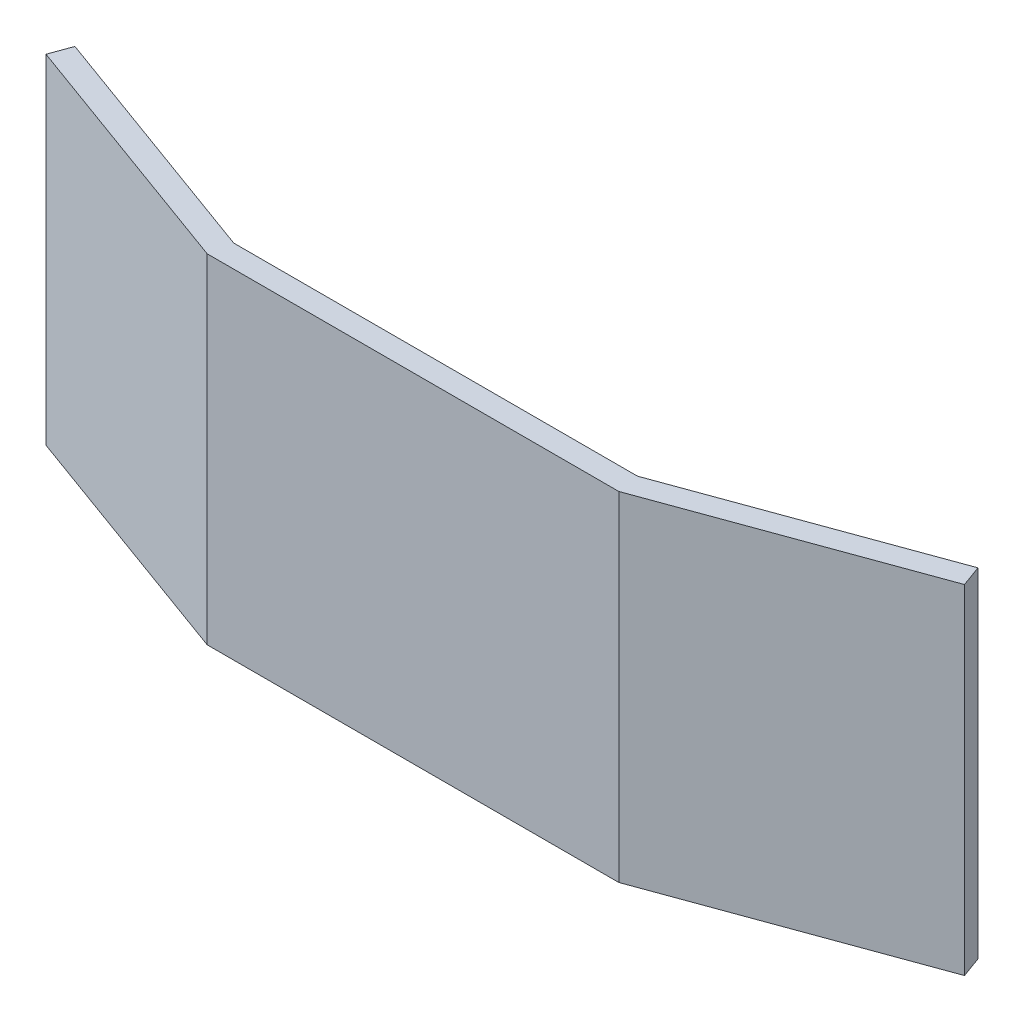
ISO-10303-21;
HEADER;
FILE_DESCRIPTION(('STEP AP214'),'2;1');
FILE_NAME('part.step','',(''),(''),'','','');
FILE_SCHEMA(('AUTOMOTIVE_DESIGN { 1 0 10303 214 1 1 1 1 }'));
ENDSEC;
DATA;
#1=APPLICATION_CONTEXT('core data for automotive mechanical design processes');
#2=APPLICATION_PROTOCOL_DEFINITION('international standard','automotive_design',2000,#1);
#3=PRODUCT_CONTEXT('',#1,'mechanical');
#4=PRODUCT('Part','Part','',(#3));
#5=PRODUCT_RELATED_PRODUCT_CATEGORY('part','',(#4));
#6=PRODUCT_DEFINITION_FORMATION('','',#4);
#7=PRODUCT_DEFINITION_CONTEXT('part definition',#1,'design');
#8=PRODUCT_DEFINITION('design','',#6,#7);
#9=PRODUCT_DEFINITION_SHAPE('','',#8);
#10=(LENGTH_UNIT() NAMED_UNIT(*) SI_UNIT(.MILLI.,.METRE.));
#11=(NAMED_UNIT(*) PLANE_ANGLE_UNIT() SI_UNIT($,.RADIAN.));
#12=(NAMED_UNIT(*) SI_UNIT($,.STERADIAN.) SOLID_ANGLE_UNIT());
#13=UNCERTAINTY_MEASURE_WITH_UNIT(LENGTH_MEASURE(1.E-05),#10,'distance_accuracy_value','');
#14=(GEOMETRIC_REPRESENTATION_CONTEXT(3) GLOBAL_UNCERTAINTY_ASSIGNED_CONTEXT((#13)) GLOBAL_UNIT_ASSIGNED_CONTEXT((#10,
#11,#12)) REPRESENTATION_CONTEXT('',''));
#15=CARTESIAN_POINT('',(0.,0.,0.));
#16=DIRECTION('',(0.,0.,1.));
#17=DIRECTION('',(1.,0.,0.));
#18=AXIS2_PLACEMENT_3D('',#15,#16,#17);
#19=CARTESIAN_POINT('',(-39.9999999999988,30.,-10.0508742855402));
#20=DIRECTION('',(-0.342020143325662,0.,0.939692620785911));
#21=DIRECTION('',(0.939692620785911,0.,0.342020143325662));
#22=AXIS2_PLACEMENT_3D('',#19,#20,#21);
#23=PLANE('',#22);
#24=DIRECTION('',(-0.939692620785911,0.,-0.342020143325662));
#25=VECTOR('',#24,1.);
#26=CARTESIAN_POINT('',(-39.9999999999988,0.,-10.0508742855402));
#27=LINE('',#26,#25);
#28=CARTESIAN_POINT('',(-17.8804046936088,0.,-2.));
#29=VERTEX_POINT('',#28);
#30=CARTESIAN_POINT('',(-39.9999999999988,0.,-10.0508742855402));
#31=VERTEX_POINT('',#30);
#32=EDGE_CURVE('E146',#29,#31,#27,.T.);
#33=ORIENTED_EDGE('',*,*,#32,.T.);
#34=DIRECTION('',(0.,-1.,0.));
#35=VECTOR('',#34,1.);
#36=CARTESIAN_POINT('',(-39.9999999999988,30.,-10.0508742855402));
#37=LINE('',#36,#35);
#38=CARTESIAN_POINT('',(-39.9999999999988,30.,-10.0508742855402));
#39=VERTEX_POINT('',#38);
#40=EDGE_CURVE('E11',#39,#31,#37,.T.);
#41=ORIENTED_EDGE('',*,*,#40,.F.);
#42=DIRECTION('',(-0.939692620785911,0.,-0.342020143325662));
#43=VECTOR('',#42,1.);
#44=CARTESIAN_POINT('',(-39.9999999999988,30.,-10.0508742855402));
#45=LINE('',#44,#43);
#46=CARTESIAN_POINT('',(-17.8804046936088,30.,-2.));
#47=VERTEX_POINT('',#46);
#48=EDGE_CURVE('E168',#47,#39,#45,.T.);
#49=ORIENTED_EDGE('',*,*,#48,.F.);
#50=DIRECTION('',(0.,-1.,0.));
#51=VECTOR('',#50,1.);
#52=CARTESIAN_POINT('',(-17.8804046936088,30.,-2.));
#53=LINE('',#52,#51);
#54=EDGE_CURVE('E142',#47,#29,#53,.T.);
#55=ORIENTED_EDGE('',*,*,#54,.T.);
#56=EDGE_LOOP('',(#33,#41,#49,#55));
#57=FACE_BOUND('',#56,.T.);
#58=ADVANCED_FACE('F45',(#57),#23,.F.);
#59=CARTESIAN_POINT('',(-39.9999999999988,30.,-10.0508742855402));
#60=DIRECTION('',(0.939692620785912,0.,0.34202014332566));
#61=DIRECTION('',(0.34202014332566,0.,-0.939692620785912));
#62=AXIS2_PLACEMENT_3D('',#59,#60,#61);
#63=PLANE('',#62);
#64=DIRECTION('',(-0.34202014332566,0.,0.939692620785912));
#65=VECTOR('',#64,1.);
#66=CARTESIAN_POINT('',(-39.9999999999988,0.,-10.0508742855402));
#67=LINE('',#66,#65);
#68=CARTESIAN_POINT('',(-40.6840402866501,0.,-8.17148904396835));
#69=VERTEX_POINT('',#68);
#70=EDGE_CURVE('E150',#31,#69,#67,.T.);
#71=ORIENTED_EDGE('',*,*,#70,.T.);
#72=DIRECTION('',(0.,-1.,0.));
#73=VECTOR('',#72,1.);
#74=CARTESIAN_POINT('',(-40.6840402866501,30.,-8.17148904396835));
#75=LINE('',#74,#73);
#76=CARTESIAN_POINT('',(-40.6840402866501,30.,-8.17148904396835));
#77=VERTEX_POINT('',#76);
#78=EDGE_CURVE('E54',#77,#69,#75,.T.);
#79=ORIENTED_EDGE('',*,*,#78,.F.);
#80=DIRECTION('',(-0.34202014332566,0.,0.939692620785912));
#81=VECTOR('',#80,1.);
#82=CARTESIAN_POINT('',(-39.9999999999988,30.,-10.0508742855402));
#83=LINE('',#82,#81);
#84=EDGE_CURVE('E105',#39,#77,#83,.T.);
#85=ORIENTED_EDGE('',*,*,#84,.F.);
#86=ORIENTED_EDGE('',*,*,#40,.T.);
#87=EDGE_LOOP('',(#71,#79,#85,#86));
#88=FACE_BOUND('',#87,.T.);
#89=ADVANCED_FACE('F214',(#88),#63,.F.);
#90=CARTESIAN_POINT('',(-40.6840402866501,30.,-8.17148904396835));
#91=DIRECTION('',(0.342020143325662,0.,-0.939692620785911));
#92=DIRECTION('',(-0.939692620785911,0.,-0.342020143325662));
#93=AXIS2_PLACEMENT_3D('',#90,#91,#92);
#94=PLANE('',#93);
#95=DIRECTION('',(0.939692620785911,0.,0.342020143325662));
#96=VECTOR('',#95,1.);
#97=CARTESIAN_POINT('',(-40.6840402866501,0.,-8.17148904396835));
#98=LINE('',#97,#96);
#99=CARTESIAN_POINT('',(-18.2330586550257,0.,0.));
#100=VERTEX_POINT('',#99);
#101=EDGE_CURVE('E153',#69,#100,#98,.T.);
#102=ORIENTED_EDGE('',*,*,#101,.T.);
#103=DIRECTION('',(0.,-1.,0.));
#104=VECTOR('',#103,1.);
#105=CARTESIAN_POINT('',(-18.2330586550257,30.,0.));
#106=LINE('',#105,#104);
#107=CARTESIAN_POINT('',(-18.2330586550257,30.,0.));
#108=VERTEX_POINT('',#107);
#109=EDGE_CURVE('E179',#108,#100,#106,.T.);
#110=ORIENTED_EDGE('',*,*,#109,.F.);
#111=DIRECTION('',(0.939692620785911,0.,0.342020143325662));
#112=VECTOR('',#111,1.);
#113=CARTESIAN_POINT('',(-40.6840402866501,30.,-8.17148904396835));
#114=LINE('',#113,#112);
#115=EDGE_CURVE('E189',#77,#108,#114,.T.);
#116=ORIENTED_EDGE('',*,*,#115,.F.);
#117=ORIENTED_EDGE('',*,*,#78,.T.);
#118=EDGE_LOOP('',(#102,#110,#116,#117));
#119=FACE_BOUND('',#118,.T.);
#120=ADVANCED_FACE('F187',(#119),#94,.F.);
#121=CARTESIAN_POINT('',(-18.2330586550257,30.,0.));
#122=DIRECTION('',(0.,0.,-1.));
#123=DIRECTION('',(-1.,0.,0.));
#124=AXIS2_PLACEMENT_3D('',#121,#122,#123);
#125=PLANE('',#124);
#126=DIRECTION('',(1.,0.,0.));
#127=VECTOR('',#126,1.);
#128=CARTESIAN_POINT('',(-18.2330586550257,0.,0.));
#129=LINE('',#128,#127);
#130=CARTESIAN_POINT('',(18.2330586550257,0.,0.));
#131=VERTEX_POINT('',#130);
#132=EDGE_CURVE('E156',#100,#131,#129,.T.);
#133=ORIENTED_EDGE('',*,*,#132,.T.);
#134=DIRECTION('',(0.,-1.,0.));
#135=VECTOR('',#134,1.);
#136=CARTESIAN_POINT('',(18.2330586550257,30.,0.));
#137=LINE('',#136,#135);
#138=CARTESIAN_POINT('',(18.2330586550257,30.,0.));
#139=VERTEX_POINT('',#138);
#140=EDGE_CURVE('E175',#139,#131,#137,.T.);
#141=ORIENTED_EDGE('',*,*,#140,.F.);
#142=DIRECTION('',(1.,0.,0.));
#143=VECTOR('',#142,1.);
#144=CARTESIAN_POINT('',(-18.2330586550257,30.,0.));
#145=LINE('',#144,#143);
#146=EDGE_CURVE('E202',#108,#139,#145,.T.);
#147=ORIENTED_EDGE('',*,*,#146,.F.);
#148=ORIENTED_EDGE('',*,*,#109,.T.);
#149=EDGE_LOOP('',(#133,#141,#147,#148));
#150=FACE_BOUND('',#149,.T.);
#151=ADVANCED_FACE('F197',(#150),#125,.F.);
#152=CARTESIAN_POINT('',(18.2330586550257,30.,0.));
#153=DIRECTION('',(-0.342020143325674,0.,-0.939692620785906));
#154=DIRECTION('',(-0.939692620785906,0.,0.342020143325674));
#155=AXIS2_PLACEMENT_3D('',#152,#153,#154);
#156=PLANE('',#155);
#157=DIRECTION('',(0.939692620785906,0.,-0.342020143325674));
#158=VECTOR('',#157,1.);
#159=CARTESIAN_POINT('',(18.2330586550257,0.,0.));
#160=LINE('',#159,#158);
#161=CARTESIAN_POINT('',(40.6840402866522,0.,-8.17148904396945));
#162=VERTEX_POINT('',#161);
#163=EDGE_CURVE('E159',#131,#162,#160,.T.);
#164=ORIENTED_EDGE('',*,*,#163,.T.);
#165=DIRECTION('',(0.,-1.,0.));
#166=VECTOR('',#165,1.);
#167=CARTESIAN_POINT('',(40.6840402866522,30.,-8.17148904396945));
#168=LINE('',#167,#166);
#169=CARTESIAN_POINT('',(40.6840402866522,30.,-8.17148904396945));
#170=VERTEX_POINT('',#169);
#171=EDGE_CURVE('E135',#170,#162,#168,.T.);
#172=ORIENTED_EDGE('',*,*,#171,.F.);
#173=DIRECTION('',(0.939692620785906,0.,-0.342020143325674));
#174=VECTOR('',#173,1.);
#175=CARTESIAN_POINT('',(18.2330586550257,30.,0.));
#176=LINE('',#175,#174);
#177=EDGE_CURVE('E124',#139,#170,#176,.T.);
#178=ORIENTED_EDGE('',*,*,#177,.F.);
#179=ORIENTED_EDGE('',*,*,#140,.T.);
#180=EDGE_LOOP('',(#164,#172,#178,#179));
#181=FACE_BOUND('',#180,.T.);
#182=ADVANCED_FACE('F200',(#181),#156,.F.);
#183=CARTESIAN_POINT('',(40.6840402866522,30.,-8.17148904396945));
#184=DIRECTION('',(-0.939692620785906,0.,0.342020143325675));
#185=DIRECTION('',(0.342020143325675,0.,0.939692620785906));
#186=AXIS2_PLACEMENT_3D('',#183,#184,#185);
#187=PLANE('',#186);
#188=DIRECTION('',(-0.342020143325675,0.,-0.939692620785906));
#189=VECTOR('',#188,1.);
#190=CARTESIAN_POINT('',(40.6840402866522,0.,-8.17148904396945));
#191=LINE('',#190,#189);
#192=CARTESIAN_POINT('',(40.0000000000013,0.,-10.0508742855402));
#193=VERTEX_POINT('',#192);
#194=EDGE_CURVE('E133',#162,#193,#191,.T.);
#195=ORIENTED_EDGE('',*,*,#194,.T.);
#196=DIRECTION('',(0.,-1.,0.));
#197=VECTOR('',#196,1.);
#198=CARTESIAN_POINT('',(40.0000000000013,30.,-10.0508742855402));
#199=LINE('',#198,#197);
#200=CARTESIAN_POINT('',(40.0000000000013,30.,-10.0508742855402));
#201=VERTEX_POINT('',#200);
#202=EDGE_CURVE('E130',#201,#193,#199,.T.);
#203=ORIENTED_EDGE('',*,*,#202,.F.);
#204=DIRECTION('',(-0.342020143325675,0.,-0.939692620785906));
#205=VECTOR('',#204,1.);
#206=CARTESIAN_POINT('',(40.6840402866522,30.,-8.17148904396945));
#207=LINE('',#206,#205);
#208=EDGE_CURVE('E118',#170,#201,#207,.T.);
#209=ORIENTED_EDGE('',*,*,#208,.F.);
#210=ORIENTED_EDGE('',*,*,#171,.T.);
#211=EDGE_LOOP('',(#195,#203,#209,#210));
#212=FACE_BOUND('',#211,.T.);
#213=ADVANCED_FACE('F131',(#212),#187,.F.);
#214=CARTESIAN_POINT('',(40.0000000000013,30.,-10.0508742855402));
#215=DIRECTION('',(0.342020143325675,0.,0.939692620785906));
#216=DIRECTION('',(0.939692620785906,0.,-0.342020143325675));
#217=AXIS2_PLACEMENT_3D('',#214,#215,#216);
#218=PLANE('',#217);
#219=DIRECTION('',(-0.939692620785906,0.,0.342020143325675));
#220=VECTOR('',#219,1.);
#221=CARTESIAN_POINT('',(40.0000000000013,0.,-10.0508742855402));
#222=LINE('',#221,#220);
#223=CARTESIAN_POINT('',(17.8804046936121,0.,-2.));
#224=VERTEX_POINT('',#223);
#225=EDGE_CURVE('E91',#193,#224,#222,.T.);
#226=ORIENTED_EDGE('',*,*,#225,.T.);
#227=DIRECTION('',(0.,-1.,0.));
#228=VECTOR('',#227,1.);
#229=CARTESIAN_POINT('',(17.8804046936121,30.,-2.));
#230=LINE('',#229,#228);
#231=CARTESIAN_POINT('',(17.8804046936121,30.,-2.));
#232=VERTEX_POINT('',#231);
#233=EDGE_CURVE('E136',#232,#224,#230,.T.);
#234=ORIENTED_EDGE('',*,*,#233,.F.);
#235=DIRECTION('',(-0.939692620785906,0.,0.342020143325675));
#236=VECTOR('',#235,1.);
#237=CARTESIAN_POINT('',(40.0000000000013,30.,-10.0508742855402));
#238=LINE('',#237,#236);
#239=EDGE_CURVE('E122',#201,#232,#238,.T.);
#240=ORIENTED_EDGE('',*,*,#239,.F.);
#241=ORIENTED_EDGE('',*,*,#202,.T.);
#242=EDGE_LOOP('',(#226,#234,#240,#241));
#243=FACE_BOUND('',#242,.T.);
#244=ADVANCED_FACE('F138',(#243),#218,.F.);
#245=CARTESIAN_POINT('',(-17.8804046936088,30.,-2.));
#246=DIRECTION('',(0.,0.,1.));
#247=DIRECTION('',(1.,0.,0.));
#248=AXIS2_PLACEMENT_3D('',#245,#246,#247);
#249=PLANE('',#248);
#250=DIRECTION('',(-1.,0.,0.));
#251=VECTOR('',#250,1.);
#252=CARTESIAN_POINT('',(-17.8804046936088,0.,-2.));
#253=LINE('',#252,#251);
#254=EDGE_CURVE('E97',#224,#29,#253,.T.);
#255=ORIENTED_EDGE('',*,*,#254,.T.);
#256=ORIENTED_EDGE('',*,*,#54,.F.);
#257=DIRECTION('',(-1.,0.,0.));
#258=VECTOR('',#257,1.);
#259=CARTESIAN_POINT('',(-17.8804046936088,30.,-2.));
#260=LINE('',#259,#258);
#261=EDGE_CURVE('E62',#232,#47,#260,.T.);
#262=ORIENTED_EDGE('',*,*,#261,.F.);
#263=ORIENTED_EDGE('',*,*,#233,.T.);
#264=EDGE_LOOP('',(#255,#256,#262,#263));
#265=FACE_BOUND('',#264,.T.);
#266=ADVANCED_FACE('F230',(#265),#249,.F.);
#267=CARTESIAN_POINT('',(0.,30.,0.));
#268=DIRECTION('',(0.,-1.,0.));
#269=DIRECTION('',(0.,0.,-1.));
#270=AXIS2_PLACEMENT_3D('',#267,#268,#269);
#271=PLANE('',#270);
#272=ORIENTED_EDGE('',*,*,#48,.T.);
#273=ORIENTED_EDGE('',*,*,#84,.T.);
#274=ORIENTED_EDGE('',*,*,#115,.T.);
#275=ORIENTED_EDGE('',*,*,#146,.T.);
#276=ORIENTED_EDGE('',*,*,#177,.T.);
#277=ORIENTED_EDGE('',*,*,#208,.T.);
#278=ORIENTED_EDGE('',*,*,#239,.T.);
#279=ORIENTED_EDGE('',*,*,#261,.T.);
#280=EDGE_LOOP('',(#272,#273,#274,#275,#276,#277,#278,#279));
#281=FACE_BOUND('',#280,.T.);
#282=ADVANCED_FACE('F120',(#281),#271,.F.);
#283=CARTESIAN_POINT('',(0.,0.,0.));
#284=DIRECTION('',(0.,-1.,0.));
#285=DIRECTION('',(0.,0.,-1.));
#286=AXIS2_PLACEMENT_3D('',#283,#284,#285);
#287=PLANE('',#286);
#288=ORIENTED_EDGE('',*,*,#32,.F.);
#289=ORIENTED_EDGE('',*,*,#254,.F.);
#290=ORIENTED_EDGE('',*,*,#225,.F.);
#291=ORIENTED_EDGE('',*,*,#194,.F.);
#292=ORIENTED_EDGE('',*,*,#163,.F.);
#293=ORIENTED_EDGE('',*,*,#132,.F.);
#294=ORIENTED_EDGE('',*,*,#101,.F.);
#295=ORIENTED_EDGE('',*,*,#70,.F.);
#296=EDGE_LOOP('',(#288,#289,#290,#291,#292,#293,#294,#295));
#297=FACE_BOUND('',#296,.T.);
#298=ADVANCED_FACE('F193',(#297),#287,.T.);
#299=CLOSED_SHELL('',(#58,#89,#120,#151,#182,#213,#244,#266,#282,#298));
#300=MANIFOLD_SOLID_BREP('B2',#299);
#301=ADVANCED_BREP_SHAPE_REPRESENTATION('',(#18,#300),#14);
#302=SHAPE_DEFINITION_REPRESENTATION(#9,#301);
ENDSEC;
END-ISO-10303-21;
